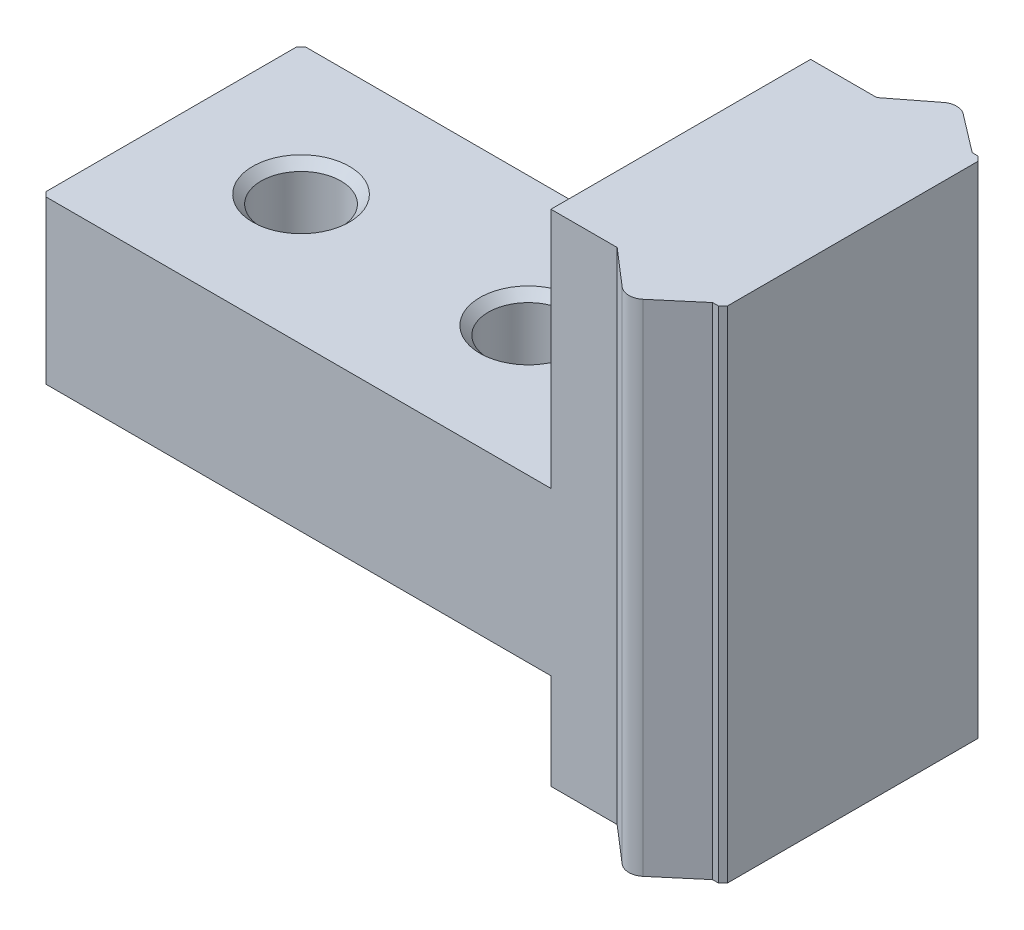
ISO-10303-21;
HEADER;
FILE_DESCRIPTION(('STEP AP214'),'2;1');
FILE_NAME('part.step','',(''),(''),'','','');
FILE_SCHEMA(('AUTOMOTIVE_DESIGN { 1 0 10303 214 1 1 1 1 }'));
ENDSEC;
DATA;
#1=APPLICATION_CONTEXT('core data for automotive mechanical design processes');
#2=APPLICATION_PROTOCOL_DEFINITION('international standard','automotive_design',2000,#1);
#3=PRODUCT_CONTEXT('',#1,'mechanical');
#4=PRODUCT('Part','Part','',(#3));
#5=PRODUCT_RELATED_PRODUCT_CATEGORY('part','',(#4));
#6=PRODUCT_DEFINITION_FORMATION('','',#4);
#7=PRODUCT_DEFINITION_CONTEXT('part definition',#1,'design');
#8=PRODUCT_DEFINITION('design','',#6,#7);
#9=PRODUCT_DEFINITION_SHAPE('','',#8);
#10=(LENGTH_UNIT() NAMED_UNIT(*) SI_UNIT(.MILLI.,.METRE.));
#11=(NAMED_UNIT(*) PLANE_ANGLE_UNIT() SI_UNIT($,.RADIAN.));
#12=(NAMED_UNIT(*) SI_UNIT($,.STERADIAN.) SOLID_ANGLE_UNIT());
#13=UNCERTAINTY_MEASURE_WITH_UNIT(LENGTH_MEASURE(1.E-05),#10,'distance_accuracy_value','');
#14=(GEOMETRIC_REPRESENTATION_CONTEXT(3) GLOBAL_UNCERTAINTY_ASSIGNED_CONTEXT((#13)) GLOBAL_UNIT_ASSIGNED_CONTEXT((#10,
#11,#12)) REPRESENTATION_CONTEXT('',''));
#15=CARTESIAN_POINT('',(0.,0.,0.));
#16=DIRECTION('',(0.,0.,1.));
#17=DIRECTION('',(1.,0.,0.));
#18=AXIS2_PLACEMENT_3D('',#15,#16,#17);
#19=CARTESIAN_POINT('',(-48.7480542146606,-28.4287336946382,-10.0152853881781));
#20=DIRECTION('',(-1.00000000000001,0.,0.));
#21=DIRECTION('',(0.,0.,1.));
#22=AXIS2_PLACEMENT_3D('',#19,#20,#21);
#23=PLANE('',#22);
#24=DIRECTION('',(0.,1.00000000000001,0.));
#25=VECTOR('',#24,1.);
#26=CARTESIAN_POINT('',(-48.7480542146606,-28.4287336946382,9.98471461182188));
#27=LINE('',#26,#25);
#28=CARTESIAN_POINT('',(-48.7480542146606,-28.4287336946382,9.98471461182188));
#29=VERTEX_POINT('',#28);
#30=CARTESIAN_POINT('',(-48.7480542146599,-21.0537336946379,9.98471461182186));
#31=VERTEX_POINT('',#30);
#32=EDGE_CURVE('E131',#29,#31,#27,.T.);
#33=ORIENTED_EDGE('',*,*,#32,.T.);
#34=DIRECTION('',(0.,0.,-1.));
#35=VECTOR('',#34,1.);
#36=CARTESIAN_POINT('',(-48.7480542146599,-21.0537336946379,9.98471461182186));
#37=LINE('',#36,#35);
#38=CARTESIAN_POINT('',(-48.7480542146599,-21.053733694638,-10.0152853881781));
#39=VERTEX_POINT('',#38);
#40=EDGE_CURVE('E335',#31,#39,#37,.T.);
#41=ORIENTED_EDGE('',*,*,#40,.T.);
#42=DIRECTION('',(0.,1.00000000000001,0.));
#43=VECTOR('',#42,1.);
#44=CARTESIAN_POINT('',(-48.7480542146606,-28.4287336946382,-10.0152853881781));
#45=LINE('',#44,#43);
#46=CARTESIAN_POINT('',(-48.7480542146606,-28.4287336946382,-10.0152853881781));
#47=VERTEX_POINT('',#46);
#48=EDGE_CURVE('E11',#47,#39,#45,.T.);
#49=ORIENTED_EDGE('',*,*,#48,.F.);
#50=DIRECTION('',(0.,0.,1.));
#51=VECTOR('',#50,1.);
#52=CARTESIAN_POINT('',(-48.7480542146606,-28.4287336946382,-10.0152853881781));
#53=LINE('',#52,#51);
#54=EDGE_CURVE('E260',#47,#29,#53,.T.);
#55=ORIENTED_EDGE('',*,*,#54,.T.);
#56=EDGE_LOOP('',(#33,#41,#49,#55));
#57=FACE_BOUND('',#56,.T.);
#58=ADVANCED_FACE('F46',(#57),#23,.T.);
#59=DIRECTION('',(0.,0.,-1.));
#60=VECTOR('',#59,1.);
#61=CARTESIAN_POINT('',(-48.7480542146599,-8.55373369463773,9.98471461182188));
#62=LINE('',#61,#60);
#63=CARTESIAN_POINT('',(-48.7480542146599,-8.55373369463773,9.98471461182188));
#64=VERTEX_POINT('',#63);
#65=CARTESIAN_POINT('',(-48.7480542146599,-8.55373369463786,-10.0152853881781));
#66=VERTEX_POINT('',#65);
#67=EDGE_CURVE('E352',#64,#66,#62,.T.);
#68=ORIENTED_EDGE('',*,*,#67,.F.);
#69=CARTESIAN_POINT('',(-48.7480542146599,10.0712663053626,9.98471461182186));
#70=VERTEX_POINT('',#69);
#71=EDGE_CURVE('E206',#64,#70,#27,.T.);
#72=ORIENTED_EDGE('',*,*,#71,.T.);
#73=DIRECTION('',(0.,0.,1.));
#74=VECTOR('',#73,1.);
#75=CARTESIAN_POINT('',(-48.7480542146599,10.0712663053626,-10.0152853881781));
#76=LINE('',#75,#74);
#77=CARTESIAN_POINT('',(-48.7480542146599,10.0712663053626,-10.0152853881781));
#78=VERTEX_POINT('',#77);
#79=EDGE_CURVE('E207',#78,#70,#76,.T.);
#80=ORIENTED_EDGE('',*,*,#79,.F.);
#81=EDGE_CURVE('E56',#66,#78,#45,.T.);
#82=ORIENTED_EDGE('',*,*,#81,.F.);
#83=EDGE_LOOP('',(#68,#72,#80,#82));
#84=FACE_BOUND('',#83,.T.);
#85=ADVANCED_FACE('F48',(#84),#23,.T.);
#86=CARTESIAN_POINT('',(-43.6480542146606,-28.4287336946382,-10.0152853881781));
#87=DIRECTION('',(0.,0.,-1.));
#88=DIRECTION('',(-1.00000000000001,0.,0.));
#89=AXIS2_PLACEMENT_3D('',#86,#87,#88);
#90=PLANE('',#89);
#91=DIRECTION('',(-1.00000000000001,0.,0.));
#92=VECTOR('',#91,1.);
#93=CARTESIAN_POINT('',(-43.6480542146599,10.0712663053626,-10.0152853881781));
#94=LINE('',#93,#92);
#95=CARTESIAN_POINT('',(-43.6480542146599,10.0712663053626,-10.0152853881781));
#96=VERTEX_POINT('',#95);
#97=EDGE_CURVE('E257',#96,#78,#94,.T.);
#98=ORIENTED_EDGE('',*,*,#97,.F.);
#99=DIRECTION('',(0.,1.00000000000001,0.));
#100=VECTOR('',#99,1.);
#101=CARTESIAN_POINT('',(-43.6480542146606,-28.4287336946382,-10.0152853881781));
#102=LINE('',#101,#100);
#103=CARTESIAN_POINT('',(-43.6480542146606,-28.4287336946382,-10.0152853881781));
#104=VERTEX_POINT('',#103);
#105=EDGE_CURVE('E181',#104,#96,#102,.T.);
#106=ORIENTED_EDGE('',*,*,#105,.F.);
#107=DIRECTION('',(-1.00000000000001,0.,0.));
#108=VECTOR('',#107,1.);
#109=CARTESIAN_POINT('',(-43.6480542146606,-28.4287336946382,-10.0152853881781));
#110=LINE('',#109,#108);
#111=EDGE_CURVE('E191',#104,#47,#110,.T.);
#112=ORIENTED_EDGE('',*,*,#111,.T.);
#113=ORIENTED_EDGE('',*,*,#48,.T.);
#114=DIRECTION('',(-1.00000000000001,0.,0.));
#115=VECTOR('',#114,1.);
#116=CARTESIAN_POINT('',(-48.7480542146599,-21.053733694638,-10.0152853881781));
#117=LINE('',#116,#115);
#118=CARTESIAN_POINT('',(-87.6445008240666,-21.0537336946381,-10.0152853881781));
#119=VERTEX_POINT('',#118);
#120=EDGE_CURVE('E64',#39,#119,#117,.T.);
#121=ORIENTED_EDGE('',*,*,#120,.T.);
#122=DIRECTION('',(0.,1.00000000000001,0.));
#123=VECTOR('',#122,1.);
#124=CARTESIAN_POINT('',(-87.6445008240666,-21.0537336946381,-10.0152853881781));
#125=LINE('',#124,#123);
#126=CARTESIAN_POINT('',(-87.644500824068,-8.55373369463802,-10.0152853881781));
#127=VERTEX_POINT('',#126);
#128=EDGE_CURVE('E212',#119,#127,#125,.T.);
#129=ORIENTED_EDGE('',*,*,#128,.T.);
#130=DIRECTION('',(-1.00000000000001,0.,0.));
#131=VECTOR('',#130,1.);
#132=CARTESIAN_POINT('',(-48.7480542146599,-8.55373369463786,-10.0152853881781));
#133=LINE('',#132,#131);
#134=EDGE_CURVE('E324',#66,#127,#133,.T.);
#135=ORIENTED_EDGE('',*,*,#134,.F.);
#136=ORIENTED_EDGE('',*,*,#81,.T.);
#137=EDGE_LOOP('',(#98,#106,#112,#113,#121,#129,#135,#136));
#138=FACE_BOUND('',#137,.T.);
#139=ADVANCED_FACE('F495',(#138),#90,.T.);
#140=CARTESIAN_POINT('',(-40.7643457833539,-28.4287336946382,-12.2528567687626));
#141=DIRECTION('',(-0.61303325495466,0.,-0.790057104467584));
#142=DIRECTION('',(-0.790057104467596,0.,0.613033254954654));
#143=AXIS2_PLACEMENT_3D('',#140,#141,#142);
#144=PLANE('',#143);
#145=DIRECTION('',(-0.790057104467596,0.,0.613033254954654));
#146=VECTOR('',#145,1.);
#147=CARTESIAN_POINT('',(-40.7643457833532,10.0712663053624,-12.2528567687626));
#148=LINE('',#147,#146);
#149=CARTESIAN_POINT('',(-40.7643457833532,10.0712663053624,-12.2528567687626));
#150=VERTEX_POINT('',#149);
#151=EDGE_CURVE('E175',#150,#96,#148,.T.);
#152=ORIENTED_EDGE('',*,*,#151,.F.);
#153=DIRECTION('',(0.,1.00000000000001,0.));
#154=VECTOR('',#153,1.);
#155=CARTESIAN_POINT('',(-40.7643457833539,-28.4287336946382,-12.2528567687626));
#156=LINE('',#155,#154);
#157=CARTESIAN_POINT('',(-40.7643457833539,-28.4287336946382,-12.2528567687626));
#158=VERTEX_POINT('',#157);
#159=EDGE_CURVE('E169',#158,#150,#156,.T.);
#160=ORIENTED_EDGE('',*,*,#159,.F.);
#161=DIRECTION('',(-0.790057104467596,0.,0.613033254954654));
#162=VECTOR('',#161,1.);
#163=CARTESIAN_POINT('',(-40.7643457833539,-28.4287336946382,-12.2528567687626));
#164=LINE('',#163,#162);
#165=EDGE_CURVE('E172',#158,#104,#164,.T.);
#166=ORIENTED_EDGE('',*,*,#165,.T.);
#167=ORIENTED_EDGE('',*,*,#105,.T.);
#168=EDGE_LOOP('',(#152,#160,#166,#167));
#169=FACE_BOUND('',#168,.T.);
#170=ADVANCED_FACE('F171',(#169),#144,.T.);
#171=CARTESIAN_POINT('',(-39.9980542146606,-28.4287336946381,-11.2652853881782));
#172=DIRECTION('',(0.,1.00000000000001,0.));
#173=DIRECTION('',(0.,0.,1.));
#174=AXIS2_PLACEMENT_3D('',#171,#172,#173);
#175=CYLINDRICAL_SURFACE('',#174,1.24999999999999);
#176=CARTESIAN_POINT('',(-39.9980542146599,10.0712663053624,-11.2652853881781));
#177=DIRECTION('',(0.,1.00000000000001,0.));
#178=DIRECTION('',(0.,0.,1.));
#179=AXIS2_PLACEMENT_3D('',#176,#177,#178);
#180=CIRCLE('',#179,1.24999999999999);
#181=CARTESIAN_POINT('',(-39.2399817675201,10.0712663053624,-12.259179831712));
#182=VERTEX_POINT('',#181);
#183=EDGE_CURVE('E252',#182,#150,#180,.T.);
#184=ORIENTED_EDGE('',*,*,#183,.F.);
#185=DIRECTION('',(0.,1.00000000000001,0.));
#186=VECTOR('',#185,1.);
#187=CARTESIAN_POINT('',(-39.2399817675208,-28.4287336946381,-12.259179831712));
#188=LINE('',#187,#186);
#189=CARTESIAN_POINT('',(-39.2399817675208,-28.4287336946381,-12.259179831712));
#190=VERTEX_POINT('',#189);
#191=EDGE_CURVE('E182',#190,#182,#188,.T.);
#192=ORIENTED_EDGE('',*,*,#191,.F.);
#193=CARTESIAN_POINT('',(-39.9980542146606,-28.4287336946381,-11.2652853881782));
#194=DIRECTION('',(0.,1.00000000000001,0.));
#195=DIRECTION('',(0.,0.,1.));
#196=AXIS2_PLACEMENT_3D('',#193,#194,#195);
#197=CIRCLE('',#196,1.24999999999999);
#198=EDGE_CURVE('E188',#190,#158,#197,.T.);
#199=ORIENTED_EDGE('',*,*,#198,.T.);
#200=ORIENTED_EDGE('',*,*,#159,.T.);
#201=EDGE_LOOP('',(#184,#192,#199,#200));
#202=FACE_BOUND('',#201,.T.);
#203=ADVANCED_FACE('F194',(#202),#175,.T.);
#204=CARTESIAN_POINT('',(-36.2980542146606,-28.4287336946379,-10.0152853881781));
#205=DIRECTION('',(0.606457957711857,0.,-0.795115554827078));
#206=DIRECTION('',(-0.79511555482709,0.,-0.606457957711851));
#207=AXIS2_PLACEMENT_3D('',#204,#205,#206);
#208=PLANE('',#207);
#209=DIRECTION('',(-0.795115554827089,0.,-0.606457957711851));
#210=VECTOR('',#209,1.);
#211=CARTESIAN_POINT('',(-36.2980542146599,10.0712663053624,-10.0152853881781));
#212=LINE('',#211,#210);
#213=CARTESIAN_POINT('',(-36.2980542146599,10.0712663053624,-10.0152853881781));
#214=VERTEX_POINT('',#213);
#215=EDGE_CURVE('E248',#214,#182,#212,.T.);
#216=ORIENTED_EDGE('',*,*,#215,.F.);
#217=DIRECTION('',(0.,1.00000000000001,0.));
#218=VECTOR('',#217,1.);
#219=CARTESIAN_POINT('',(-36.2980542146606,-28.4287336946379,-10.0152853881781));
#220=LINE('',#219,#218);
#221=CARTESIAN_POINT('',(-36.2980542146606,-28.4287336946379,-10.0152853881781));
#222=VERTEX_POINT('',#221);
#223=EDGE_CURVE('E266',#222,#214,#220,.T.);
#224=ORIENTED_EDGE('',*,*,#223,.F.);
#225=DIRECTION('',(-0.795115554827089,0.,-0.606457957711851));
#226=VECTOR('',#225,1.);
#227=CARTESIAN_POINT('',(-36.2980542146606,-28.4287336946379,-10.0152853881781));
#228=LINE('',#227,#226);
#229=EDGE_CURVE('E196',#222,#190,#228,.T.);
#230=ORIENTED_EDGE('',*,*,#229,.T.);
#231=ORIENTED_EDGE('',*,*,#191,.T.);
#232=EDGE_LOOP('',(#216,#224,#230,#231));
#233=FACE_BOUND('',#232,.T.);
#234=ADVANCED_FACE('F526',(#233),#208,.T.);
#235=CARTESIAN_POINT('',(-35.8516076052539,-28.4287336946379,-10.0152853881781));
#236=DIRECTION('',(0.,0.,-1.));
#237=DIRECTION('',(-1.00000000000001,0.,0.));
#238=AXIS2_PLACEMENT_3D('',#235,#236,#237);
#239=PLANE('',#238);
#240=DIRECTION('',(-1.00000000000001,0.,0.));
#241=VECTOR('',#240,1.);
#242=CARTESIAN_POINT('',(-35.8516076052532,10.0712663053624,-10.0152853881781));
#243=LINE('',#242,#241);
#244=CARTESIAN_POINT('',(-35.8516076052532,10.0712663053624,-10.0152853881781));
#245=VERTEX_POINT('',#244);
#246=EDGE_CURVE('E244',#245,#214,#243,.T.);
#247=ORIENTED_EDGE('',*,*,#246,.F.);
#248=DIRECTION('',(0.,1.00000000000001,0.));
#249=VECTOR('',#248,1.);
#250=CARTESIAN_POINT('',(-35.8516076052539,-28.4287336946379,-10.0152853881781));
#251=LINE('',#250,#249);
#252=CARTESIAN_POINT('',(-35.8516076052539,-28.4287336946379,-10.0152853881781));
#253=VERTEX_POINT('',#252);
#254=EDGE_CURVE('E269',#253,#245,#251,.T.);
#255=ORIENTED_EDGE('',*,*,#254,.F.);
#256=DIRECTION('',(-1.00000000000001,0.,0.));
#257=VECTOR('',#256,1.);
#258=CARTESIAN_POINT('',(-35.8516076052539,-28.4287336946379,-10.0152853881781));
#259=LINE('',#258,#257);
#260=EDGE_CURVE('E200',#253,#222,#259,.T.);
#261=ORIENTED_EDGE('',*,*,#260,.T.);
#262=ORIENTED_EDGE('',*,*,#223,.T.);
#263=EDGE_LOOP('',(#247,#255,#261,#262));
#264=FACE_BOUND('',#263,.T.);
#265=ADVANCED_FACE('F411',(#264),#239,.T.);
#266=CARTESIAN_POINT('',(-35.4980542146606,-28.4287336946379,-9.66173199758486));
#267=DIRECTION('',(0.707106781186545,0.,-0.707106781186556));
#268=DIRECTION('',(-0.707106781186562,0.,-0.707106781186539));
#269=AXIS2_PLACEMENT_3D('',#266,#267,#268);
#270=PLANE('',#269);
#271=DIRECTION('',(-0.707106781186562,0.,-0.707106781186539));
#272=VECTOR('',#271,1.);
#273=CARTESIAN_POINT('',(-35.4980542146599,10.0712663053624,-9.66173199758486));
#274=LINE('',#273,#272);
#275=CARTESIAN_POINT('',(-35.4980542146599,10.0712663053624,-9.66173199758486));
#276=VERTEX_POINT('',#275);
#277=EDGE_CURVE('E240',#276,#245,#274,.T.);
#278=ORIENTED_EDGE('',*,*,#277,.F.);
#279=DIRECTION('',(0.,1.00000000000001,0.));
#280=VECTOR('',#279,1.);
#281=CARTESIAN_POINT('',(-35.4980542146606,-28.4287336946379,-9.66173199758486));
#282=LINE('',#281,#280);
#283=CARTESIAN_POINT('',(-35.4980542146606,-28.4287336946379,-9.66173199758486));
#284=VERTEX_POINT('',#283);
#285=EDGE_CURVE('E272',#284,#276,#282,.T.);
#286=ORIENTED_EDGE('',*,*,#285,.F.);
#287=DIRECTION('',(-0.707106781186562,0.,-0.707106781186539));
#288=VECTOR('',#287,1.);
#289=CARTESIAN_POINT('',(-35.4980542146606,-28.4287336946379,-9.66173199758486));
#290=LINE('',#289,#288);
#291=EDGE_CURVE('E402',#284,#253,#290,.T.);
#292=ORIENTED_EDGE('',*,*,#291,.T.);
#293=ORIENTED_EDGE('',*,*,#254,.T.);
#294=EDGE_LOOP('',(#278,#286,#292,#293));
#295=FACE_BOUND('',#294,.T.);
#296=ADVANCED_FACE('F417',(#295),#270,.T.);
#297=CARTESIAN_POINT('',(-35.4980542146606,-28.4287336946379,9.63116122122859));
#298=DIRECTION('',(1.00000000000001,0.,0.));
#299=DIRECTION('',(0.,0.,-1.));
#300=AXIS2_PLACEMENT_3D('',#297,#298,#299);
#301=PLANE('',#300);
#302=DIRECTION('',(0.,0.,-1.));
#303=VECTOR('',#302,1.);
#304=CARTESIAN_POINT('',(-35.4980542146599,10.0712663053624,9.63116122122858));
#305=LINE('',#304,#303);
#306=CARTESIAN_POINT('',(-35.4980542146599,10.0712663053624,9.63116122122858));
#307=VERTEX_POINT('',#306);
#308=EDGE_CURVE('E236',#307,#276,#305,.T.);
#309=ORIENTED_EDGE('',*,*,#308,.F.);
#310=DIRECTION('',(0.,1.00000000000001,0.));
#311=VECTOR('',#310,1.);
#312=CARTESIAN_POINT('',(-35.4980542146606,-28.4287336946379,9.63116122122859));
#313=LINE('',#312,#311);
#314=CARTESIAN_POINT('',(-35.4980542146606,-28.4287336946379,9.63116122122859));
#315=VERTEX_POINT('',#314);
#316=EDGE_CURVE('E275',#315,#307,#313,.T.);
#317=ORIENTED_EDGE('',*,*,#316,.F.);
#318=DIRECTION('',(0.,0.,-1.));
#319=VECTOR('',#318,1.);
#320=CARTESIAN_POINT('',(-35.4980542146606,-28.4287336946379,9.63116122122859));
#321=LINE('',#320,#319);
#322=EDGE_CURVE('E398',#315,#284,#321,.T.);
#323=ORIENTED_EDGE('',*,*,#322,.T.);
#324=ORIENTED_EDGE('',*,*,#285,.T.);
#325=EDGE_LOOP('',(#309,#317,#323,#324));
#326=FACE_BOUND('',#325,.T.);
#327=ADVANCED_FACE('F420',(#326),#301,.T.);
#328=CARTESIAN_POINT('',(-35.8516076052539,-28.4287336946379,9.98471461182188));
#329=DIRECTION('',(0.707106781186545,0.,0.707106781186556));
#330=DIRECTION('',(0.707106781186562,0.,-0.707106781186539));
#331=AXIS2_PLACEMENT_3D('',#328,#329,#330);
#332=PLANE('',#331);
#333=DIRECTION('',(0.707106781186562,0.,-0.707106781186539));
#334=VECTOR('',#333,1.);
#335=CARTESIAN_POINT('',(-35.8516076052532,10.0712663053624,9.98471461182186));
#336=LINE('',#335,#334);
#337=CARTESIAN_POINT('',(-35.8516076052532,10.0712663053624,9.98471461182186));
#338=VERTEX_POINT('',#337);
#339=EDGE_CURVE('E232',#338,#307,#336,.T.);
#340=ORIENTED_EDGE('',*,*,#339,.F.);
#341=DIRECTION('',(0.,1.00000000000001,0.));
#342=VECTOR('',#341,1.);
#343=CARTESIAN_POINT('',(-35.8516076052539,-28.4287336946379,9.98471461182188));
#344=LINE('',#343,#342);
#345=CARTESIAN_POINT('',(-35.8516076052539,-28.4287336946379,9.98471461182188));
#346=VERTEX_POINT('',#345);
#347=EDGE_CURVE('E278',#346,#338,#344,.T.);
#348=ORIENTED_EDGE('',*,*,#347,.F.);
#349=DIRECTION('',(0.707106781186562,0.,-0.707106781186539));
#350=VECTOR('',#349,1.);
#351=CARTESIAN_POINT('',(-35.8516076052539,-28.4287336946379,9.98471461182188));
#352=LINE('',#351,#350);
#353=EDGE_CURVE('E394',#346,#315,#352,.T.);
#354=ORIENTED_EDGE('',*,*,#353,.T.);
#355=ORIENTED_EDGE('',*,*,#316,.T.);
#356=EDGE_LOOP('',(#340,#348,#354,#355));
#357=FACE_BOUND('',#356,.T.);
#358=ADVANCED_FACE('F425',(#357),#332,.T.);
#359=CARTESIAN_POINT('',(-36.2980542146606,-28.4287336946379,9.98471461182188));
#360=DIRECTION('',(0.,0.,1.));
#361=DIRECTION('',(1.00000000000001,0.,0.));
#362=AXIS2_PLACEMENT_3D('',#359,#360,#361);
#363=PLANE('',#362);
#364=DIRECTION('',(1.00000000000001,0.,0.));
#365=VECTOR('',#364,1.);
#366=CARTESIAN_POINT('',(-36.2980542146599,10.0712663053624,9.98471461182186));
#367=LINE('',#366,#365);
#368=CARTESIAN_POINT('',(-36.2980542146599,10.0712663053624,9.98471461182186));
#369=VERTEX_POINT('',#368);
#370=EDGE_CURVE('E228',#369,#338,#367,.T.);
#371=ORIENTED_EDGE('',*,*,#370,.F.);
#372=DIRECTION('',(0.,1.00000000000001,0.));
#373=VECTOR('',#372,1.);
#374=CARTESIAN_POINT('',(-36.2980542146606,-28.4287336946379,9.98471461182188));
#375=LINE('',#374,#373);
#376=CARTESIAN_POINT('',(-36.2980542146606,-28.4287336946379,9.98471461182188));
#377=VERTEX_POINT('',#376);
#378=EDGE_CURVE('E281',#377,#369,#375,.T.);
#379=ORIENTED_EDGE('',*,*,#378,.F.);
#380=DIRECTION('',(1.00000000000001,0.,0.));
#381=VECTOR('',#380,1.);
#382=CARTESIAN_POINT('',(-36.2980542146606,-28.4287336946379,9.98471461182188));
#383=LINE('',#382,#381);
#384=EDGE_CURVE('E390',#377,#346,#383,.T.);
#385=ORIENTED_EDGE('',*,*,#384,.T.);
#386=ORIENTED_EDGE('',*,*,#347,.T.);
#387=EDGE_LOOP('',(#371,#379,#385,#386));
#388=FACE_BOUND('',#387,.T.);
#389=ADVANCED_FACE('F428',(#388),#363,.T.);
#390=CARTESIAN_POINT('',(-39.1893456907511,-28.4287336946381,12.437862304132));
#391=DIRECTION('',(0.646966819127613,0.,0.762518153848095));
#392=DIRECTION('',(0.762518153848107,0.,-0.646966819127607));
#393=AXIS2_PLACEMENT_3D('',#390,#391,#392);
#394=PLANE('',#393);
#395=DIRECTION('',(0.762518153848107,0.,-0.646966819127607));
#396=VECTOR('',#395,1.);
#397=CARTESIAN_POINT('',(-39.1893456907504,10.0712663053622,12.437862304132));
#398=LINE('',#397,#396);
#399=CARTESIAN_POINT('',(-39.1893456907504,10.0712663053622,12.437862304132));
#400=VERTEX_POINT('',#399);
#401=EDGE_CURVE('E224',#400,#369,#398,.T.);
#402=ORIENTED_EDGE('',*,*,#401,.F.);
#403=DIRECTION('',(0.,1.00000000000001,0.));
#404=VECTOR('',#403,1.);
#405=CARTESIAN_POINT('',(-39.1893456907511,-28.4287336946381,12.437862304132));
#406=LINE('',#405,#404);
#407=CARTESIAN_POINT('',(-39.1893456907511,-28.4287336946381,12.437862304132));
#408=VERTEX_POINT('',#407);
#409=EDGE_CURVE('E284',#408,#400,#406,.T.);
#410=ORIENTED_EDGE('',*,*,#409,.F.);
#411=DIRECTION('',(0.762518153848107,0.,-0.646966819127607));
#412=VECTOR('',#411,1.);
#413=CARTESIAN_POINT('',(-39.1893456907511,-28.4287336946381,12.437862304132));
#414=LINE('',#413,#412);
#415=EDGE_CURVE('E386',#408,#377,#414,.T.);
#416=ORIENTED_EDGE('',*,*,#415,.T.);
#417=ORIENTED_EDGE('',*,*,#378,.T.);
#418=EDGE_LOOP('',(#402,#410,#416,#417));
#419=FACE_BOUND('',#418,.T.);
#420=ADVANCED_FACE('F433',(#419),#394,.T.);
#421=CARTESIAN_POINT('',(-39.9980542146606,-28.4287336946381,11.4847146118218));
#422=DIRECTION('',(0.,1.00000000000001,0.));
#423=DIRECTION('',(0.,0.,1.));
#424=AXIS2_PLACEMENT_3D('',#421,#422,#423);
#425=CYLINDRICAL_SURFACE('',#424,1.25000000000002);
#426=CARTESIAN_POINT('',(-39.9980542146599,10.0712663053622,11.4847146118219));
#427=DIRECTION('',(0.,1.00000000000001,0.));
#428=DIRECTION('',(0.,0.,1.));
#429=AXIS2_PLACEMENT_3D('',#426,#427,#428);
#430=CIRCLE('',#429,1.25000000000002);
#431=CARTESIAN_POINT('',(-40.8149582266734,10.0712663053622,12.4308477077213));
#432=VERTEX_POINT('',#431);
#433=EDGE_CURVE('E220',#432,#400,#430,.T.);
#434=ORIENTED_EDGE('',*,*,#433,.F.);
#435=DIRECTION('',(0.,1.00000000000001,0.));
#436=VECTOR('',#435,1.);
#437=CARTESIAN_POINT('',(-40.8149582266741,-28.4287336946382,12.4308477077213));
#438=LINE('',#437,#436);
#439=CARTESIAN_POINT('',(-40.8149582266741,-28.4287336946382,12.4308477077213));
#440=VERTEX_POINT('',#439);
#441=EDGE_CURVE('E287',#440,#432,#438,.T.);
#442=ORIENTED_EDGE('',*,*,#441,.F.);
#443=CARTESIAN_POINT('',(-39.9980542146606,-28.4287336946381,11.4847146118218));
#444=DIRECTION('',(0.,1.00000000000001,0.));
#445=DIRECTION('',(0.,0.,1.));
#446=AXIS2_PLACEMENT_3D('',#443,#444,#445);
#447=CIRCLE('',#446,1.25000000000002);
#448=EDGE_CURVE('E382',#440,#408,#447,.T.);
#449=ORIENTED_EDGE('',*,*,#448,.T.);
#450=ORIENTED_EDGE('',*,*,#409,.T.);
#451=EDGE_LOOP('',(#434,#442,#449,#450));
#452=FACE_BOUND('',#451,.T.);
#453=ADVANCED_FACE('F436',(#452),#425,.T.);
#454=CARTESIAN_POINT('',(-43.6480542146606,-28.4287336946382,9.98471461182188));
#455=DIRECTION('',(-0.653523209610788,0.,0.756906476719563));
#456=DIRECTION('',(0.756906476719575,0.,0.653523209610782));
#457=AXIS2_PLACEMENT_3D('',#454,#455,#456);
#458=PLANE('',#457);
#459=DIRECTION('',(0.756906476719574,0.,0.653523209610782));
#460=VECTOR('',#459,1.);
#461=CARTESIAN_POINT('',(-43.6480542146599,10.0712663053624,9.98471461182186));
#462=LINE('',#461,#460);
#463=CARTESIAN_POINT('',(-43.6480542146599,10.0712663053624,9.98471461182186));
#464=VERTEX_POINT('',#463);
#465=EDGE_CURVE('E216',#464,#432,#462,.T.);
#466=ORIENTED_EDGE('',*,*,#465,.F.);
#467=DIRECTION('',(0.,1.00000000000001,0.));
#468=VECTOR('',#467,1.);
#469=CARTESIAN_POINT('',(-43.6480542146606,-28.4287336946382,9.98471461182188));
#470=LINE('',#469,#468);
#471=CARTESIAN_POINT('',(-43.6480542146606,-28.4287336946382,9.98471461182188));
#472=VERTEX_POINT('',#471);
#473=EDGE_CURVE('E290',#472,#464,#470,.T.);
#474=ORIENTED_EDGE('',*,*,#473,.F.);
#475=DIRECTION('',(0.756906476719574,0.,0.653523209610782));
#476=VECTOR('',#475,1.);
#477=CARTESIAN_POINT('',(-43.6480542146606,-28.4287336946382,9.98471461182188));
#478=LINE('',#477,#476);
#479=EDGE_CURVE('E378',#472,#440,#478,.T.);
#480=ORIENTED_EDGE('',*,*,#479,.T.);
#481=ORIENTED_EDGE('',*,*,#441,.T.);
#482=EDGE_LOOP('',(#466,#474,#480,#481));
#483=FACE_BOUND('',#482,.T.);
#484=ADVANCED_FACE('F440',(#483),#458,.T.);
#485=CARTESIAN_POINT('',(-48.7480542146606,-28.4287336946382,9.98471461182188));
#486=DIRECTION('',(0.,0.,1.));
#487=DIRECTION('',(1.00000000000001,0.,0.));
#488=AXIS2_PLACEMENT_3D('',#485,#486,#487);
#489=PLANE('',#488);
#490=DIRECTION('',(1.00000000000001,0.,0.));
#491=VECTOR('',#490,1.);
#492=CARTESIAN_POINT('',(-48.7480542146599,10.0712663053626,9.98471461182186));
#493=LINE('',#492,#491);
#494=EDGE_CURVE('E211',#70,#464,#493,.T.);
#495=ORIENTED_EDGE('',*,*,#494,.F.);
#496=ORIENTED_EDGE('',*,*,#71,.F.);
#497=DIRECTION('',(1.00000000000001,0.,0.));
#498=VECTOR('',#497,1.);
#499=CARTESIAN_POINT('',(-87.644500824068,-8.55373369463784,9.98471461182188));
#500=LINE('',#499,#498);
#501=CARTESIAN_POINT('',(-87.644500824068,-8.55373369463784,9.98471461182188));
#502=VERTEX_POINT('',#501);
#503=EDGE_CURVE('E348',#502,#64,#500,.T.);
#504=ORIENTED_EDGE('',*,*,#503,.F.);
#505=DIRECTION('',(0.,1.00000000000001,0.));
#506=VECTOR('',#505,1.);
#507=CARTESIAN_POINT('',(-87.6445008240666,-21.053733694638,9.98471461182186));
#508=LINE('',#507,#506);
#509=CARTESIAN_POINT('',(-87.6445008240666,-21.053733694638,9.98471461182186));
#510=VERTEX_POINT('',#509);
#511=EDGE_CURVE('E362',#510,#502,#508,.T.);
#512=ORIENTED_EDGE('',*,*,#511,.F.);
#513=DIRECTION('',(1.00000000000001,0.,0.));
#514=VECTOR('',#513,1.);
#515=CARTESIAN_POINT('',(-87.6445008240666,-21.053733694638,9.98471461182186));
#516=LINE('',#515,#514);
#517=EDGE_CURVE('E332',#510,#31,#516,.T.);
#518=ORIENTED_EDGE('',*,*,#517,.T.);
#519=ORIENTED_EDGE('',*,*,#32,.F.);
#520=DIRECTION('',(1.00000000000001,0.,0.));
#521=VECTOR('',#520,1.);
#522=CARTESIAN_POINT('',(-48.7480542146606,-28.4287336946382,9.98471461182188));
#523=LINE('',#522,#521);
#524=EDGE_CURVE('E375',#29,#472,#523,.T.);
#525=ORIENTED_EDGE('',*,*,#524,.T.);
#526=ORIENTED_EDGE('',*,*,#473,.T.);
#527=EDGE_LOOP('',(#495,#496,#504,#512,#518,#519,#525,#526));
#528=FACE_BOUND('',#527,.T.);
#529=ADVANCED_FACE('F442',(#528),#489,.T.);
#530=CARTESIAN_POINT('',(-39.9980542146606,-28.4287336946381,11.4847146118218));
#531=DIRECTION('',(0.,1.00000000000001,0.));
#532=DIRECTION('',(0.,0.,1.));
#533=AXIS2_PLACEMENT_3D('',#530,#531,#532);
#534=PLANE('',#533);
#535=ORIENTED_EDGE('',*,*,#54,.F.);
#536=ORIENTED_EDGE('',*,*,#111,.F.);
#537=ORIENTED_EDGE('',*,*,#165,.F.);
#538=ORIENTED_EDGE('',*,*,#198,.F.);
#539=ORIENTED_EDGE('',*,*,#229,.F.);
#540=ORIENTED_EDGE('',*,*,#260,.F.);
#541=ORIENTED_EDGE('',*,*,#291,.F.);
#542=ORIENTED_EDGE('',*,*,#322,.F.);
#543=ORIENTED_EDGE('',*,*,#353,.F.);
#544=ORIENTED_EDGE('',*,*,#384,.F.);
#545=ORIENTED_EDGE('',*,*,#415,.F.);
#546=ORIENTED_EDGE('',*,*,#448,.F.);
#547=ORIENTED_EDGE('',*,*,#479,.F.);
#548=ORIENTED_EDGE('',*,*,#524,.F.);
#549=EDGE_LOOP('',(#535,#536,#537,#538,#539,#540,#541,#542,#543,#544,#545,#546,#547,#548));
#550=FACE_BOUND('',#549,.T.);
#551=ADVANCED_FACE('F186',(#550),#534,.F.);
#552=CARTESIAN_POINT('',(-39.9980542146599,10.0712663053622,11.4847146118219));
#553=DIRECTION('',(0.,1.00000000000001,0.));
#554=DIRECTION('',(0.,0.,1.));
#555=AXIS2_PLACEMENT_3D('',#552,#553,#554);
#556=PLANE('',#555);
#557=ORIENTED_EDGE('',*,*,#79,.T.);
#558=ORIENTED_EDGE('',*,*,#494,.T.);
#559=ORIENTED_EDGE('',*,*,#465,.T.);
#560=ORIENTED_EDGE('',*,*,#433,.T.);
#561=ORIENTED_EDGE('',*,*,#401,.T.);
#562=ORIENTED_EDGE('',*,*,#370,.T.);
#563=ORIENTED_EDGE('',*,*,#339,.T.);
#564=ORIENTED_EDGE('',*,*,#308,.T.);
#565=ORIENTED_EDGE('',*,*,#277,.T.);
#566=ORIENTED_EDGE('',*,*,#246,.T.);
#567=ORIENTED_EDGE('',*,*,#215,.T.);
#568=ORIENTED_EDGE('',*,*,#183,.T.);
#569=ORIENTED_EDGE('',*,*,#151,.T.);
#570=ORIENTED_EDGE('',*,*,#97,.T.);
#571=EDGE_LOOP('',(#557,#558,#559,#560,#561,#562,#563,#564,#565,#566,#567,#568,#569,#570));
#572=FACE_BOUND('',#571,.T.);
#573=ADVANCED_FACE('F524',(#572),#556,.T.);
#574=CARTESIAN_POINT('',(-87.6445008240666,-21.0537336946381,-10.0152853881781));
#575=DIRECTION('',(-0.707106781186527,0.,-0.707106781186574));
#576=DIRECTION('',(-0.70710678118658,0.,0.707106781186521));
#577=AXIS2_PLACEMENT_3D('',#574,#575,#576);
#578=PLANE('',#577);
#579=DIRECTION('',(-0.70710678118658,0.,0.707106781186521));
#580=VECTOR('',#579,1.);
#581=CARTESIAN_POINT('',(-87.644500824068,-8.55373369463802,-10.0152853881781));
#582=LINE('',#581,#580);
#583=CARTESIAN_POINT('',(-87.9980542146613,-8.55373369463788,-9.66173199758486));
#584=VERTEX_POINT('',#583);
#585=EDGE_CURVE('E297',#127,#584,#582,.T.);
#586=ORIENTED_EDGE('',*,*,#585,.F.);
#587=ORIENTED_EDGE('',*,*,#128,.F.);
#588=DIRECTION('',(-0.70710678118658,0.,0.707106781186521));
#589=VECTOR('',#588,1.);
#590=CARTESIAN_POINT('',(-87.6445008240666,-21.0537336946381,-10.0152853881781));
#591=LINE('',#590,#589);
#592=CARTESIAN_POINT('',(-87.99805421466,-21.0537336946381,-9.66173199758486));
#593=VERTEX_POINT('',#592);
#594=EDGE_CURVE('E319',#119,#593,#591,.T.);
#595=ORIENTED_EDGE('',*,*,#594,.T.);
#596=DIRECTION('',(0.,1.00000000000001,0.));
#597=VECTOR('',#596,1.);
#598=CARTESIAN_POINT('',(-87.99805421466,-21.0537336946381,-9.66173199758486));
#599=LINE('',#598,#597);
#600=EDGE_CURVE('E339',#593,#584,#599,.T.);
#601=ORIENTED_EDGE('',*,*,#600,.T.);
#602=EDGE_LOOP('',(#586,#587,#595,#601));
#603=FACE_BOUND('',#602,.T.);
#604=ADVANCED_FACE('F488',(#603),#578,.T.);
#605=CARTESIAN_POINT('',(-87.99805421466,-21.053733694638,9.63116122122858));
#606=DIRECTION('',(-0.707106781186527,0.,0.707106781186574));
#607=DIRECTION('',(0.70710678118658,0.,0.707106781186521));
#608=AXIS2_PLACEMENT_3D('',#605,#606,#607);
#609=PLANE('',#608);
#610=DIRECTION('',(0.70710678118658,0.,0.707106781186521));
#611=VECTOR('',#610,1.);
#612=CARTESIAN_POINT('',(-87.9980542146613,-8.55373369463784,9.63116122122859));
#613=LINE('',#612,#611);
#614=CARTESIAN_POINT('',(-87.9980542146613,-8.55373369463784,9.63116122122859));
#615=VERTEX_POINT('',#614);
#616=EDGE_CURVE('E344',#615,#502,#613,.T.);
#617=ORIENTED_EDGE('',*,*,#616,.F.);
#618=DIRECTION('',(0.,1.00000000000001,0.));
#619=VECTOR('',#618,1.);
#620=CARTESIAN_POINT('',(-87.99805421466,-21.053733694638,9.63116122122858));
#621=LINE('',#620,#619);
#622=CARTESIAN_POINT('',(-87.99805421466,-21.053733694638,9.63116122122858));
#623=VERTEX_POINT('',#622);
#624=EDGE_CURVE('E366',#623,#615,#621,.T.);
#625=ORIENTED_EDGE('',*,*,#624,.F.);
#626=DIRECTION('',(0.70710678118658,0.,0.707106781186521));
#627=VECTOR('',#626,1.);
#628=CARTESIAN_POINT('',(-87.99805421466,-21.053733694638,9.63116122122858));
#629=LINE('',#628,#627);
#630=EDGE_CURVE('E328',#623,#510,#629,.T.);
#631=ORIENTED_EDGE('',*,*,#630,.T.);
#632=ORIENTED_EDGE('',*,*,#511,.T.);
#633=EDGE_LOOP('',(#617,#625,#631,#632));
#634=FACE_BOUND('',#633,.T.);
#635=ADVANCED_FACE('F476',(#634),#609,.T.);
#636=CARTESIAN_POINT('',(-87.99805421466,-21.0537336946381,-9.66173199758486));
#637=DIRECTION('',(-1.00000000000001,0.,0.));
#638=DIRECTION('',(0.,0.,1.));
#639=AXIS2_PLACEMENT_3D('',#636,#637,#638);
#640=PLANE('',#639);
#641=DIRECTION('',(0.,0.,1.));
#642=VECTOR('',#641,1.);
#643=CARTESIAN_POINT('',(-87.9980542146613,-8.55373369463788,-9.66173199758486));
#644=LINE('',#643,#642);
#645=EDGE_CURVE('E305',#584,#615,#644,.T.);
#646=ORIENTED_EDGE('',*,*,#645,.F.);
#647=ORIENTED_EDGE('',*,*,#600,.F.);
#648=DIRECTION('',(0.,0.,1.));
#649=VECTOR('',#648,1.);
#650=CARTESIAN_POINT('',(-87.99805421466,-21.0537336946381,-9.66173199758486));
#651=LINE('',#650,#649);
#652=EDGE_CURVE('E323',#593,#623,#651,.T.);
#653=ORIENTED_EDGE('',*,*,#652,.T.);
#654=ORIENTED_EDGE('',*,*,#624,.T.);
#655=EDGE_LOOP('',(#646,#647,#653,#654));
#656=FACE_BOUND('',#655,.T.);
#657=ADVANCED_FACE('F478',(#656),#640,.T.);
#658=CARTESIAN_POINT('',(80.7519457853418,-21.0537336946379,-0.0152853881781323));
#659=DIRECTION('',(0.,1.00000000000001,0.));
#660=DIRECTION('',(0.,0.,1.));
#661=AXIS2_PLACEMENT_3D('',#658,#659,#660);
#662=PLANE('',#661);
#663=CARTESIAN_POINT('',(-60.4980542146599,-21.0537336946379,-0.0152853881781323));
#664=DIRECTION('',(0.,-1.00000000000001,0.));
#665=DIRECTION('',(0.,0.,-1.));
#666=AXIS2_PLACEMENT_3D('',#663,#664,#665);
#667=CIRCLE('',#666,3.75);
#668=CARTESIAN_POINT('',(-60.4980542146599,-21.0537336946379,-3.76528538817814));
#669=VERTEX_POINT('',#668);
#670=EDGE_CURVE('E881',#669,#669,#667,.T.);
#671=ORIENTED_EDGE('',*,*,#670,.F.);
#672=EDGE_LOOP('',(#671));
#673=FACE_BOUND('',#672,.T.);
#674=CARTESIAN_POINT('',(-77.9980542146599,-21.0537336946379,-0.0152853881781323));
#675=DIRECTION('',(0.,-1.00000000000001,0.));
#676=DIRECTION('',(0.,0.,-1.));
#677=AXIS2_PLACEMENT_3D('',#674,#675,#676);
#678=CIRCLE('',#677,3.75);
#679=CARTESIAN_POINT('',(-77.9980542146599,-21.0537336946379,-3.76528538817814));
#680=VERTEX_POINT('',#679);
#681=EDGE_CURVE('E298',#680,#680,#678,.T.);
#682=ORIENTED_EDGE('',*,*,#681,.F.);
#683=EDGE_LOOP('',(#682));
#684=FACE_BOUND('',#683,.T.);
#685=ORIENTED_EDGE('',*,*,#594,.F.);
#686=ORIENTED_EDGE('',*,*,#120,.F.);
#687=ORIENTED_EDGE('',*,*,#40,.F.);
#688=ORIENTED_EDGE('',*,*,#517,.F.);
#689=ORIENTED_EDGE('',*,*,#630,.F.);
#690=ORIENTED_EDGE('',*,*,#652,.F.);
#691=EDGE_LOOP('',(#685,#686,#687,#688,#689,#690));
#692=FACE_BOUND('',#691,.T.);
#693=ADVANCED_FACE('F477',(#673,#684,#692),#662,.F.);
#694=CARTESIAN_POINT('',(80.7519457853416,-8.55373369463784,-0.0152853881781323));
#695=DIRECTION('',(0.,1.00000000000001,0.));
#696=DIRECTION('',(0.,0.,1.));
#697=AXIS2_PLACEMENT_3D('',#694,#695,#696);
#698=PLANE('',#697);
#699=CARTESIAN_POINT('',(-60.4980542146599,-8.5537336946377,-0.0152853881781323));
#700=DIRECTION('',(0.,1.00000000000001,0.));
#701=DIRECTION('',(0.,0.,1.));
#702=AXIS2_PLACEMENT_3D('',#699,#700,#701);
#703=CIRCLE('',#702,3.725);
#704=CARTESIAN_POINT('',(-60.4980542146599,-8.5537336946377,3.70971461182187));
#705=VERTEX_POINT('',#704);
#706=EDGE_CURVE('E50',#705,#705,#703,.F.);
#707=ORIENTED_EDGE('',*,*,#706,.T.);
#708=EDGE_LOOP('',(#707));
#709=FACE_BOUND('',#708,.T.);
#710=CARTESIAN_POINT('',(-77.9980542146599,-8.5537336946377,-0.0152853881781323));
#711=DIRECTION('',(0.,1.00000000000001,0.));
#712=DIRECTION('',(0.,0.,1.));
#713=AXIS2_PLACEMENT_3D('',#710,#711,#712);
#714=CIRCLE('',#713,3.725);
#715=CARTESIAN_POINT('',(-77.9980542146599,-8.5537336946377,3.70971461182187));
#716=VERTEX_POINT('',#715);
#717=EDGE_CURVE('E294',#716,#716,#714,.F.);
#718=ORIENTED_EDGE('',*,*,#717,.T.);
#719=EDGE_LOOP('',(#718));
#720=FACE_BOUND('',#719,.T.);
#721=ORIENTED_EDGE('',*,*,#585,.T.);
#722=ORIENTED_EDGE('',*,*,#645,.T.);
#723=ORIENTED_EDGE('',*,*,#616,.T.);
#724=ORIENTED_EDGE('',*,*,#503,.T.);
#725=ORIENTED_EDGE('',*,*,#67,.T.);
#726=ORIENTED_EDGE('',*,*,#134,.T.);
#727=EDGE_LOOP('',(#721,#722,#723,#724,#725,#726));
#728=FACE_BOUND('',#727,.T.);
#729=ADVANCED_FACE('F485',(#709,#720,#728),#698,.T.);
#730=CARTESIAN_POINT('',(-77.9980542146599,-20.3774836946379,-0.0152853881781323));
#731=DIRECTION('',(0.,-1.00000000000001,0.));
#732=DIRECTION('',(0.,0.,-1.));
#733=AXIS2_PLACEMENT_3D('',#730,#731,#732);
#734=CONICAL_SURFACE('',#733,3.07375000000002,0.785398163397442);
#735=ORIENTED_EDGE('',*,*,#681,.T.);
#736=EDGE_LOOP('',(#735));
#737=FACE_BOUND('',#736,.T.);
#738=CARTESIAN_POINT('',(-77.9980542146599,-20.3774836946379,-0.0152853881781323));
#739=DIRECTION('',(0.,-1.00000000000001,0.));
#740=DIRECTION('',(0.,0.,-1.));
#741=AXIS2_PLACEMENT_3D('',#738,#739,#740);
#742=CIRCLE('',#741,3.07375000000002);
#743=CARTESIAN_POINT('',(-77.9980542146599,-20.3774836946379,-3.08903538817815));
#744=VERTEX_POINT('',#743);
#745=EDGE_CURVE('E308',#744,#744,#742,.T.);
#746=ORIENTED_EDGE('',*,*,#745,.F.);
#747=EDGE_LOOP('',(#746));
#748=FACE_BOUND('',#747,.T.);
#749=ADVANCED_FACE('F666',(#737,#748),#734,.F.);
#750=CARTESIAN_POINT('',(-77.9980542146599,-8.5287336946377,-0.0152853881781323));
#751=DIRECTION('',(0.,-1.00000000000001,0.));
#752=DIRECTION('',(0.,0.,-1.));
#753=AXIS2_PLACEMENT_3D('',#750,#751,#752);
#754=CYLINDRICAL_SURFACE('',#753,3.07375000000002);
#755=ORIENTED_EDGE('',*,*,#745,.T.);
#756=EDGE_LOOP('',(#755));
#757=FACE_BOUND('',#756,.T.);
#758=CARTESIAN_POINT('',(-77.9980542146599,-9.2049836946377,-0.0152853881781323));
#759=DIRECTION('',(0.,-1.00000000000001,0.));
#760=DIRECTION('',(0.,0.,-1.));
#761=AXIS2_PLACEMENT_3D('',#758,#759,#760);
#762=CIRCLE('',#761,3.07375000000002);
#763=CARTESIAN_POINT('',(-77.9980542146599,-9.2049836946377,-3.08903538817815));
#764=VERTEX_POINT('',#763);
#765=EDGE_CURVE('E315',#764,#764,#762,.T.);
#766=ORIENTED_EDGE('',*,*,#765,.F.);
#767=EDGE_LOOP('',(#766));
#768=FACE_BOUND('',#767,.T.);
#769=ADVANCED_FACE('F676',(#757,#768),#754,.F.);
#770=CARTESIAN_POINT('',(-77.9980542146599,-8.5287336946377,-0.0152853881781323));
#771=DIRECTION('',(0.,1.00000000000001,0.));
#772=DIRECTION('',(0.,0.,1.));
#773=AXIS2_PLACEMENT_3D('',#770,#771,#772);
#774=CONICAL_SURFACE('',#773,3.75,0.785398163397439);
#775=ORIENTED_EDGE('',*,*,#717,.F.);
#776=EDGE_LOOP('',(#775));
#777=FACE_BOUND('',#776,.T.);
#778=ORIENTED_EDGE('',*,*,#765,.T.);
#779=EDGE_LOOP('',(#778));
#780=FACE_BOUND('',#779,.T.);
#781=ADVANCED_FACE('F686',(#777,#780),#774,.F.);
#782=CARTESIAN_POINT('',(-60.4980542146599,-20.3774836946379,-0.0152853881781323));
#783=DIRECTION('',(0.,-1.00000000000001,0.));
#784=DIRECTION('',(0.,0.,-1.));
#785=AXIS2_PLACEMENT_3D('',#782,#783,#784);
#786=CONICAL_SURFACE('',#785,3.07375,0.785398163397455);
#787=ORIENTED_EDGE('',*,*,#670,.T.);
#788=EDGE_LOOP('',(#787));
#789=FACE_BOUND('',#788,.T.);
#790=CARTESIAN_POINT('',(-60.4980542146599,-20.3774836946379,-0.0152853881781323));
#791=DIRECTION('',(0.,-1.00000000000001,0.));
#792=DIRECTION('',(0.,0.,-1.));
#793=AXIS2_PLACEMENT_3D('',#790,#791,#792);
#794=CIRCLE('',#793,3.07375);
#795=CARTESIAN_POINT('',(-60.4980542146599,-20.3774836946379,-3.08903538817814));
#796=VERTEX_POINT('',#795);
#797=EDGE_CURVE('E876',#796,#796,#794,.T.);
#798=ORIENTED_EDGE('',*,*,#797,.F.);
#799=EDGE_LOOP('',(#798));
#800=FACE_BOUND('',#799,.T.);
#801=ADVANCED_FACE('F697',(#789,#800),#786,.F.);
#802=CARTESIAN_POINT('',(-60.4980542146599,-8.52873369463769,-0.0152853881781323));
#803=DIRECTION('',(0.,-1.00000000000001,0.));
#804=DIRECTION('',(0.,0.,-1.));
#805=AXIS2_PLACEMENT_3D('',#802,#803,#804);
#806=CYLINDRICAL_SURFACE('',#805,3.07375);
#807=ORIENTED_EDGE('',*,*,#797,.T.);
#808=EDGE_LOOP('',(#807));
#809=FACE_BOUND('',#808,.T.);
#810=CARTESIAN_POINT('',(-60.4980542146599,-9.2049836946377,-0.0152853881781323));
#811=DIRECTION('',(0.,-1.00000000000001,0.));
#812=DIRECTION('',(0.,0.,-1.));
#813=AXIS2_PLACEMENT_3D('',#810,#811,#812);
#814=CIRCLE('',#813,3.07375);
#815=CARTESIAN_POINT('',(-60.4980542146599,-9.2049836946377,-3.08903538817814));
#816=VERTEX_POINT('',#815);
#817=EDGE_CURVE('E873',#816,#816,#814,.T.);
#818=ORIENTED_EDGE('',*,*,#817,.F.);
#819=EDGE_LOOP('',(#818));
#820=FACE_BOUND('',#819,.T.);
#821=ADVANCED_FACE('F707',(#809,#820),#806,.F.);
#822=CARTESIAN_POINT('',(-60.4980542146599,-8.52873369463769,-0.0152853881781323));
#823=DIRECTION('',(0.,1.00000000000001,0.));
#824=DIRECTION('',(0.,0.,1.));
#825=AXIS2_PLACEMENT_3D('',#822,#823,#824);
#826=CONICAL_SURFACE('',#825,3.75,0.785398163397451);
#827=ORIENTED_EDGE('',*,*,#706,.F.);
#828=EDGE_LOOP('',(#827));
#829=FACE_BOUND('',#828,.T.);
#830=ORIENTED_EDGE('',*,*,#817,.T.);
#831=EDGE_LOOP('',(#830));
#832=FACE_BOUND('',#831,.T.);
#833=ADVANCED_FACE('F717',(#829,#832),#826,.F.);
#834=CLOSED_SHELL('',(#58,#85,#139,#170,#203,#234,#265,#296,#327,#358,#389,#420,#453,#484,#529,
#551,#573,#604,#635,#657,#693,#729,#749,#769,#781,#801,#821,#833));
#835=MANIFOLD_SOLID_BREP('B2',#834);
#836=ADVANCED_BREP_SHAPE_REPRESENTATION('',(#18,#835),#14);
#837=SHAPE_DEFINITION_REPRESENTATION(#9,#836);
ENDSEC;
END-ISO-10303-21;
